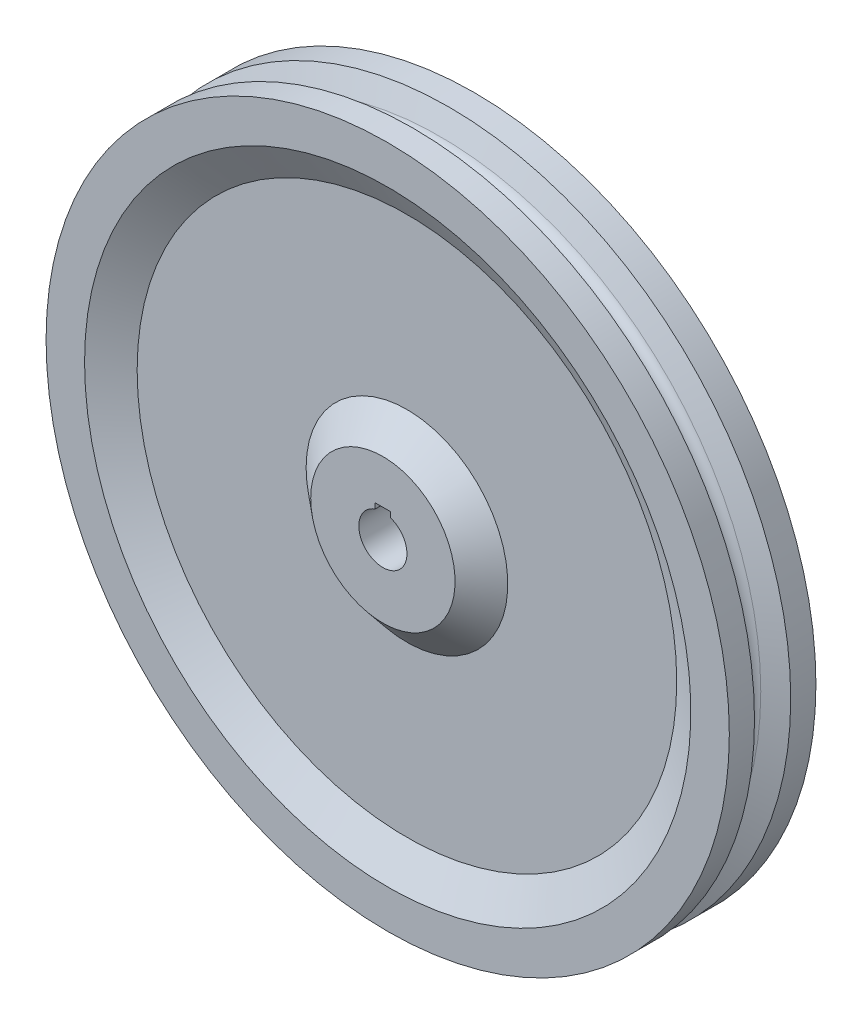
ISO-10303-21;
HEADER;
FILE_DESCRIPTION(('STEP AP214'),'2;1');
FILE_NAME('part.step','',(''),(''),'','','');
FILE_SCHEMA(('AUTOMOTIVE_DESIGN { 1 0 10303 214 1 1 1 1 }'));
ENDSEC;
DATA;
#1=APPLICATION_CONTEXT('core data for automotive mechanical design processes');
#2=APPLICATION_PROTOCOL_DEFINITION('international standard','automotive_design',2000,#1);
#3=PRODUCT_CONTEXT('',#1,'mechanical');
#4=PRODUCT('Part','Part','',(#3));
#5=PRODUCT_RELATED_PRODUCT_CATEGORY('part','',(#4));
#6=PRODUCT_DEFINITION_FORMATION('','',#4);
#7=PRODUCT_DEFINITION_CONTEXT('part definition',#1,'design');
#8=PRODUCT_DEFINITION('design','',#6,#7);
#9=PRODUCT_DEFINITION_SHAPE('','',#8);
#10=(LENGTH_UNIT() NAMED_UNIT(*) SI_UNIT(.MILLI.,.METRE.));
#11=(NAMED_UNIT(*) PLANE_ANGLE_UNIT() SI_UNIT($,.RADIAN.));
#12=(NAMED_UNIT(*) SI_UNIT($,.STERADIAN.) SOLID_ANGLE_UNIT());
#13=UNCERTAINTY_MEASURE_WITH_UNIT(LENGTH_MEASURE(1.E-05),#10,'distance_accuracy_value','');
#14=(GEOMETRIC_REPRESENTATION_CONTEXT(3) GLOBAL_UNCERTAINTY_ASSIGNED_CONTEXT((#13)) GLOBAL_UNIT_ASSIGNED_CONTEXT((#10,
#11,#12)) REPRESENTATION_CONTEXT('',''));
#15=CARTESIAN_POINT('',(0.,0.,0.));
#16=DIRECTION('',(0.,0.,1.));
#17=DIRECTION('',(1.,0.,0.));
#18=AXIS2_PLACEMENT_3D('',#15,#16,#17);
#19=CARTESIAN_POINT('',(0.,0.,0.));
#20=DIRECTION('',(0.,0.,-1.));
#21=DIRECTION('',(-1.,0.,0.));
#22=AXIS2_PLACEMENT_3D('',#19,#20,#21);
#23=TOROIDAL_SURFACE('',#22,337.,10.5);
#24=CARTESIAN_POINT('',(0.,0.,9.70073509136854));
#25=DIRECTION('',(0.,0.,-1.));
#26=DIRECTION('',(-1.,0.,0.));
#27=AXIS2_PLACEMENT_3D('',#24,#25,#26);
#28=CIRCLE('',#27,332.981823960167);
#29=CARTESIAN_POINT('',(-332.981823960167,0.,9.70073509136854));
#30=VERTEX_POINT('',#29);
#31=EDGE_CURVE('E173',#30,#30,#28,.T.);
#32=ORIENTED_EDGE('',*,*,#31,.T.);
#33=EDGE_LOOP('',(#32));
#34=FACE_BOUND('',#33,.T.);
#35=CARTESIAN_POINT('',(0.,0.,-9.70073509136854));
#36=DIRECTION('',(0.,0.,-1.));
#37=DIRECTION('',(-1.,0.,0.));
#38=AXIS2_PLACEMENT_3D('',#35,#36,#37);
#39=CIRCLE('',#38,332.981823960167);
#40=CARTESIAN_POINT('',(-332.981823960167,0.,-9.70073509136854));
#41=VERTEX_POINT('',#40);
#42=EDGE_CURVE('E145',#41,#41,#39,.T.);
#43=ORIENTED_EDGE('',*,*,#42,.F.);
#44=EDGE_LOOP('',(#43));
#45=FACE_BOUND('',#44,.T.);
#46=ADVANCED_FACE('F39',(#34,#45),#23,.F.);
#47=CARTESIAN_POINT('',(0.,0.,9.70073509136854));
#48=DIRECTION('',(0.,0.,1.));
#49=DIRECTION('',(1.,0.,0.));
#50=AXIS2_PLACEMENT_3D('',#47,#48,#49);
#51=CONICAL_SURFACE('',#50,332.981823960167,1.17809724509617);
#52=CARTESIAN_POINT('',(0.,0.,18.8209622257858));
#53=DIRECTION('',(0.,0.,-1.));
#54=DIRECTION('',(-1.,0.,0.));
#55=AXIS2_PLACEMENT_3D('',#52,#53,#54);
#56=CIRCLE('',#55,355.);
#57=CARTESIAN_POINT('',(-355.,0.,18.8209622257858));
#58=VERTEX_POINT('',#57);
#59=EDGE_CURVE('E169',#58,#58,#56,.T.);
#60=ORIENTED_EDGE('',*,*,#59,.T.);
#61=EDGE_LOOP('',(#60));
#62=FACE_BOUND('',#61,.T.);
#63=ORIENTED_EDGE('',*,*,#31,.F.);
#64=EDGE_LOOP('',(#63));
#65=FACE_BOUND('',#64,.T.);
#66=ADVANCED_FACE('F194',(#62,#65),#51,.T.);
#67=CARTESIAN_POINT('',(0.,0.,0.));
#68=DIRECTION('',(0.,0.,-1.));
#69=DIRECTION('',(-1.,0.,0.));
#70=AXIS2_PLACEMENT_3D('',#67,#68,#69);
#71=CYLINDRICAL_SURFACE('',#70,355.);
#72=CARTESIAN_POINT('',(0.,0.,45.));
#73=DIRECTION('',(0.,0.,-1.));
#74=DIRECTION('',(-1.,0.,0.));
#75=AXIS2_PLACEMENT_3D('',#72,#73,#74);
#76=CIRCLE('',#75,355.);
#77=CARTESIAN_POINT('',(-355.,0.,45.));
#78=VERTEX_POINT('',#77);
#79=EDGE_CURVE('E165',#78,#78,#76,.T.);
#80=ORIENTED_EDGE('',*,*,#79,.T.);
#81=EDGE_LOOP('',(#80));
#82=FACE_BOUND('',#81,.T.);
#83=ORIENTED_EDGE('',*,*,#59,.F.);
#84=EDGE_LOOP('',(#83));
#85=FACE_BOUND('',#84,.T.);
#86=ADVANCED_FACE('F199',(#82,#85),#71,.T.);
#87=CARTESIAN_POINT('',(0.,315.,45.));
#88=DIRECTION('',(0.,0.,1.));
#89=DIRECTION('',(1.,0.,0.));
#90=AXIS2_PLACEMENT_3D('',#87,#88,#89);
#91=PLANE('',#90);
#92=CARTESIAN_POINT('',(0.,0.,45.));
#93=DIRECTION('',(0.,0.,-1.));
#94=DIRECTION('',(-1.,0.,0.));
#95=AXIS2_PLACEMENT_3D('',#92,#93,#94);
#96=CIRCLE('',#95,315.);
#97=CARTESIAN_POINT('',(-315.,0.,45.));
#98=VERTEX_POINT('',#97);
#99=EDGE_CURVE('E161',#98,#98,#96,.T.);
#100=ORIENTED_EDGE('',*,*,#99,.T.);
#101=EDGE_LOOP('',(#100));
#102=FACE_BOUND('',#101,.T.);
#103=ORIENTED_EDGE('',*,*,#79,.F.);
#104=EDGE_LOOP('',(#103));
#105=FACE_BOUND('',#104,.T.);
#106=ADVANCED_FACE('F232',(#102,#105),#91,.T.);
#107=CARTESIAN_POINT('',(0.,0.,45.));
#108=DIRECTION('',(0.,0.,1.));
#109=DIRECTION('',(1.,0.,0.));
#110=AXIS2_PLACEMENT_3D('',#107,#108,#109);
#111=CONICAL_SURFACE('',#110,315.,1.0471975511966);
#112=CARTESIAN_POINT('',(0.,0.,25.));
#113=DIRECTION('',(0.,0.,-1.));
#114=DIRECTION('',(-1.,0.,0.));
#115=AXIS2_PLACEMENT_3D('',#112,#113,#114);
#116=CIRCLE('',#115,280.358983848623);
#117=CARTESIAN_POINT('',(-280.358983848623,0.,25.));
#118=VERTEX_POINT('',#117);
#119=EDGE_CURVE('E157',#118,#118,#116,.T.);
#120=ORIENTED_EDGE('',*,*,#119,.T.);
#121=EDGE_LOOP('',(#120));
#122=FACE_BOUND('',#121,.T.);
#123=ORIENTED_EDGE('',*,*,#99,.F.);
#124=EDGE_LOOP('',(#123));
#125=FACE_BOUND('',#124,.T.);
#126=ADVANCED_FACE('F228',(#122,#125),#111,.F.);
#127=CARTESIAN_POINT('',(0.,104.793839814855,25.));
#128=DIRECTION('',(0.,0.,1.));
#129=DIRECTION('',(1.,0.,0.));
#130=AXIS2_PLACEMENT_3D('',#127,#128,#129);
#131=PLANE('',#130);
#132=CARTESIAN_POINT('',(0.,0.,25.));
#133=DIRECTION('',(0.,0.,-1.));
#134=DIRECTION('',(-1.,0.,0.));
#135=AXIS2_PLACEMENT_3D('',#132,#133,#134);
#136=CIRCLE('',#135,104.793839814855);
#137=CARTESIAN_POINT('',(-104.793839814855,0.,25.));
#138=VERTEX_POINT('',#137);
#139=EDGE_CURVE('E153',#138,#138,#136,.T.);
#140=ORIENTED_EDGE('',*,*,#139,.T.);
#141=EDGE_LOOP('',(#140));
#142=FACE_BOUND('',#141,.T.);
#143=ORIENTED_EDGE('',*,*,#119,.F.);
#144=EDGE_LOOP('',(#143));
#145=FACE_BOUND('',#144,.T.);
#146=ADVANCED_FACE('F224',(#142,#145),#131,.T.);
#147=CARTESIAN_POINT('',(0.,0.,25.));
#148=DIRECTION('',(0.,0.,-1.));
#149=DIRECTION('',(-1.,0.,0.));
#150=AXIS2_PLACEMENT_3D('',#147,#148,#149);
#151=CONICAL_SURFACE('',#150,104.793839814855,0.872664625997163);
#152=CARTESIAN_POINT('',(0.,0.,50.));
#153=DIRECTION('',(0.,0.,-1.));
#154=DIRECTION('',(-1.,0.,0.));
#155=AXIS2_PLACEMENT_3D('',#152,#153,#154);
#156=CIRCLE('',#155,75.);
#157=CARTESIAN_POINT('',(-75.,0.,50.));
#158=VERTEX_POINT('',#157);
#159=EDGE_CURVE('E149',#158,#158,#156,.T.);
#160=ORIENTED_EDGE('',*,*,#159,.T.);
#161=EDGE_LOOP('',(#160));
#162=FACE_BOUND('',#161,.T.);
#163=ORIENTED_EDGE('',*,*,#139,.F.);
#164=EDGE_LOOP('',(#163));
#165=FACE_BOUND('',#164,.T.);
#166=ADVANCED_FACE('F217',(#162,#165),#151,.T.);
#167=CARTESIAN_POINT('',(0.,0.,50.));
#168=DIRECTION('',(0.,0.,1.));
#169=DIRECTION('',(1.,0.,0.));
#170=AXIS2_PLACEMENT_3D('',#167,#168,#169);
#171=PLANE('',#170);
#172=DIRECTION('',(0.,-1.,0.));
#173=VECTOR('',#172,1.);
#174=CARTESIAN_POINT('',(-8.,20.7,50.));
#175=LINE('',#174,#173);
#176=CARTESIAN_POINT('',(-8.,29.3,50.));
#177=VERTEX_POINT('',#176);
#178=CARTESIAN_POINT('',(-8.,23.685438564654,50.));
#179=VERTEX_POINT('',#178);
#180=EDGE_CURVE('E106',#177,#179,#175,.T.);
#181=ORIENTED_EDGE('',*,*,#180,.F.);
#182=DIRECTION('',(-1.,0.,0.));
#183=VECTOR('',#182,1.);
#184=CARTESIAN_POINT('',(8.,29.3,50.));
#185=LINE('',#184,#183);
#186=CARTESIAN_POINT('',(8.,29.3,50.));
#187=VERTEX_POINT('',#186);
#188=EDGE_CURVE('E103',#187,#177,#185,.T.);
#189=ORIENTED_EDGE('',*,*,#188,.F.);
#190=DIRECTION('',(0.,1.,0.));
#191=VECTOR('',#190,1.);
#192=CARTESIAN_POINT('',(8.,20.7,50.));
#193=LINE('',#192,#191);
#194=CARTESIAN_POINT('',(7.99999999999999,23.685438564654,50.));
#195=VERTEX_POINT('',#194);
#196=EDGE_CURVE('E81',#195,#187,#193,.T.);
#197=ORIENTED_EDGE('',*,*,#196,.F.);
#198=CARTESIAN_POINT('',(0.,0.,50.));
#199=DIRECTION('',(0.,0.,1.));
#200=DIRECTION('',(1.,0.,0.));
#201=AXIS2_PLACEMENT_3D('',#198,#199,#200);
#202=CIRCLE('',#201,25.);
#203=EDGE_CURVE('E114',#179,#195,#202,.T.);
#204=ORIENTED_EDGE('',*,*,#203,.F.);
#205=EDGE_LOOP('',(#181,#189,#197,#204));
#206=FACE_BOUND('',#205,.T.);
#207=ORIENTED_EDGE('',*,*,#159,.F.);
#208=EDGE_LOOP('',(#207));
#209=FACE_BOUND('',#208,.T.);
#210=ADVANCED_FACE('F182',(#206,#209),#171,.T.);
#211=CARTESIAN_POINT('',(0.,0.,-9.70073509136854));
#212=DIRECTION('',(0.,0.,-1.));
#213=DIRECTION('',(1.,0.,0.));
#214=AXIS2_PLACEMENT_3D('',#211,#212,#213);
#215=CONICAL_SURFACE('',#214,332.981823960167,1.17809724509617);
#216=CARTESIAN_POINT('',(0.,0.,-18.8209622257858));
#217=DIRECTION('',(0.,0.,-1.));
#218=DIRECTION('',(-1.,0.,0.));
#219=AXIS2_PLACEMENT_3D('',#216,#217,#218);
#220=CIRCLE('',#219,355.);
#221=CARTESIAN_POINT('',(-355.,0.,-18.8209622257858));
#222=VERTEX_POINT('',#221);
#223=EDGE_CURVE('E141',#222,#222,#220,.T.);
#224=ORIENTED_EDGE('',*,*,#223,.F.);
#225=EDGE_LOOP('',(#224));
#226=FACE_BOUND('',#225,.T.);
#227=ORIENTED_EDGE('',*,*,#42,.T.);
#228=EDGE_LOOP('',(#227));
#229=FACE_BOUND('',#228,.T.);
#230=ADVANCED_FACE('F205',(#226,#229),#215,.T.);
#231=CARTESIAN_POINT('',(0.,0.,0.));
#232=DIRECTION('',(0.,0.,1.));
#233=DIRECTION('',(-1.,0.,0.));
#234=AXIS2_PLACEMENT_3D('',#231,#232,#233);
#235=CYLINDRICAL_SURFACE('',#234,355.);
#236=CARTESIAN_POINT('',(0.,0.,-45.));
#237=DIRECTION('',(0.,0.,-1.));
#238=DIRECTION('',(-1.,0.,0.));
#239=AXIS2_PLACEMENT_3D('',#236,#237,#238);
#240=CIRCLE('',#239,355.);
#241=CARTESIAN_POINT('',(-355.,0.,-45.));
#242=VERTEX_POINT('',#241);
#243=EDGE_CURVE('E137',#242,#242,#240,.T.);
#244=ORIENTED_EDGE('',*,*,#243,.F.);
#245=EDGE_LOOP('',(#244));
#246=FACE_BOUND('',#245,.T.);
#247=ORIENTED_EDGE('',*,*,#223,.T.);
#248=EDGE_LOOP('',(#247));
#249=FACE_BOUND('',#248,.T.);
#250=ADVANCED_FACE('F207',(#246,#249),#235,.T.);
#251=CARTESIAN_POINT('',(0.,315.,-45.));
#252=DIRECTION('',(0.,0.,-1.));
#253=DIRECTION('',(1.,0.,0.));
#254=AXIS2_PLACEMENT_3D('',#251,#252,#253);
#255=PLANE('',#254);
#256=CARTESIAN_POINT('',(0.,0.,-45.));
#257=DIRECTION('',(0.,0.,-1.));
#258=DIRECTION('',(-1.,0.,0.));
#259=AXIS2_PLACEMENT_3D('',#256,#257,#258);
#260=CIRCLE('',#259,315.);
#261=CARTESIAN_POINT('',(-315.,0.,-45.));
#262=VERTEX_POINT('',#261);
#263=EDGE_CURVE('E133',#262,#262,#260,.T.);
#264=ORIENTED_EDGE('',*,*,#263,.F.);
#265=EDGE_LOOP('',(#264));
#266=FACE_BOUND('',#265,.T.);
#267=ORIENTED_EDGE('',*,*,#243,.T.);
#268=EDGE_LOOP('',(#267));
#269=FACE_BOUND('',#268,.T.);
#270=ADVANCED_FACE('F214',(#266,#269),#255,.T.);
#271=CARTESIAN_POINT('',(0.,0.,-45.));
#272=DIRECTION('',(0.,0.,-1.));
#273=DIRECTION('',(1.,0.,0.));
#274=AXIS2_PLACEMENT_3D('',#271,#272,#273);
#275=CONICAL_SURFACE('',#274,315.,1.0471975511966);
#276=CARTESIAN_POINT('',(0.,0.,-25.));
#277=DIRECTION('',(0.,0.,-1.));
#278=DIRECTION('',(-1.,0.,0.));
#279=AXIS2_PLACEMENT_3D('',#276,#277,#278);
#280=CIRCLE('',#279,280.358983848623);
#281=CARTESIAN_POINT('',(-280.358983848623,0.,-25.));
#282=VERTEX_POINT('',#281);
#283=EDGE_CURVE('E129',#282,#282,#280,.T.);
#284=ORIENTED_EDGE('',*,*,#283,.F.);
#285=EDGE_LOOP('',(#284));
#286=FACE_BOUND('',#285,.T.);
#287=ORIENTED_EDGE('',*,*,#263,.T.);
#288=EDGE_LOOP('',(#287));
#289=FACE_BOUND('',#288,.T.);
#290=ADVANCED_FACE('F318',(#286,#289),#275,.F.);
#291=CARTESIAN_POINT('',(0.,104.793839814855,-25.));
#292=DIRECTION('',(0.,0.,-1.));
#293=DIRECTION('',(1.,0.,0.));
#294=AXIS2_PLACEMENT_3D('',#291,#292,#293);
#295=PLANE('',#294);
#296=CARTESIAN_POINT('',(0.,0.,-25.));
#297=DIRECTION('',(0.,0.,-1.));
#298=DIRECTION('',(-1.,0.,0.));
#299=AXIS2_PLACEMENT_3D('',#296,#297,#298);
#300=CIRCLE('',#299,104.793839814855);
#301=CARTESIAN_POINT('',(-104.793839814855,0.,-25.));
#302=VERTEX_POINT('',#301);
#303=EDGE_CURVE('E125',#302,#302,#300,.T.);
#304=ORIENTED_EDGE('',*,*,#303,.F.);
#305=EDGE_LOOP('',(#304));
#306=FACE_BOUND('',#305,.T.);
#307=ORIENTED_EDGE('',*,*,#283,.T.);
#308=EDGE_LOOP('',(#307));
#309=FACE_BOUND('',#308,.T.);
#310=ADVANCED_FACE('F313',(#306,#309),#295,.T.);
#311=CARTESIAN_POINT('',(0.,0.,-25.));
#312=DIRECTION('',(0.,0.,1.));
#313=DIRECTION('',(-1.,0.,0.));
#314=AXIS2_PLACEMENT_3D('',#311,#312,#313);
#315=CONICAL_SURFACE('',#314,104.793839814855,0.872664625997163);
#316=CARTESIAN_POINT('',(0.,0.,-50.));
#317=DIRECTION('',(0.,0.,-1.));
#318=DIRECTION('',(-1.,0.,0.));
#319=AXIS2_PLACEMENT_3D('',#316,#317,#318);
#320=CIRCLE('',#319,75.);
#321=CARTESIAN_POINT('',(-75.,0.,-50.));
#322=VERTEX_POINT('',#321);
#323=EDGE_CURVE('E118',#322,#322,#320,.T.);
#324=ORIENTED_EDGE('',*,*,#323,.F.);
#325=EDGE_LOOP('',(#324));
#326=FACE_BOUND('',#325,.T.);
#327=ORIENTED_EDGE('',*,*,#303,.T.);
#328=EDGE_LOOP('',(#327));
#329=FACE_BOUND('',#328,.T.);
#330=ADVANCED_FACE('F275',(#326,#329),#315,.T.);
#331=CARTESIAN_POINT('',(0.,0.,-50.));
#332=DIRECTION('',(0.,0.,-1.));
#333=DIRECTION('',(1.,0.,0.));
#334=AXIS2_PLACEMENT_3D('',#331,#332,#333);
#335=PLANE('',#334);
#336=DIRECTION('',(0.,-1.,0.));
#337=VECTOR('',#336,1.);
#338=CARTESIAN_POINT('',(-8.,20.7,-50.));
#339=LINE('',#338,#337);
#340=CARTESIAN_POINT('',(-8.,29.3,-50.));
#341=VERTEX_POINT('',#340);
#342=CARTESIAN_POINT('',(-8.,23.685438564654,-50.));
#343=VERTEX_POINT('',#342);
#344=EDGE_CURVE('E100',#341,#343,#339,.T.);
#345=ORIENTED_EDGE('',*,*,#344,.T.);
#346=CARTESIAN_POINT('',(0.,0.,-50.));
#347=DIRECTION('',(0.,0.,1.));
#348=DIRECTION('',(1.,0.,0.));
#349=AXIS2_PLACEMENT_3D('',#346,#347,#348);
#350=CIRCLE('',#349,25.);
#351=CARTESIAN_POINT('',(7.99999999999999,23.685438564654,-50.));
#352=VERTEX_POINT('',#351);
#353=EDGE_CURVE('E98',#343,#352,#350,.T.);
#354=ORIENTED_EDGE('',*,*,#353,.T.);
#355=DIRECTION('',(0.,1.,0.));
#356=VECTOR('',#355,1.);
#357=CARTESIAN_POINT('',(8.,20.7,-50.));
#358=LINE('',#357,#356);
#359=CARTESIAN_POINT('',(8.,29.3,-50.));
#360=VERTEX_POINT('',#359);
#361=EDGE_CURVE('E54',#352,#360,#358,.T.);
#362=ORIENTED_EDGE('',*,*,#361,.T.);
#363=DIRECTION('',(-1.,0.,0.));
#364=VECTOR('',#363,1.);
#365=CARTESIAN_POINT('',(8.,29.3,-50.));
#366=LINE('',#365,#364);
#367=EDGE_CURVE('E87',#360,#341,#366,.T.);
#368=ORIENTED_EDGE('',*,*,#367,.T.);
#369=EDGE_LOOP('',(#345,#354,#362,#368));
#370=FACE_BOUND('',#369,.T.);
#371=ORIENTED_EDGE('',*,*,#323,.T.);
#372=EDGE_LOOP('',(#371));
#373=FACE_BOUND('',#372,.T.);
#374=ADVANCED_FACE('F95',(#370,#373),#335,.T.);
#375=CARTESIAN_POINT('',(0.,0.,-50.));
#376=DIRECTION('',(0.,0.,1.));
#377=DIRECTION('',(1.,0.,0.));
#378=AXIS2_PLACEMENT_3D('',#375,#376,#377);
#379=CYLINDRICAL_SURFACE('',#378,25.);
#380=ORIENTED_EDGE('',*,*,#353,.F.);
#381=DIRECTION('',(0.,0.,1.));
#382=VECTOR('',#381,1.);
#383=CARTESIAN_POINT('',(-8.,23.685438564654,-50.));
#384=LINE('',#383,#382);
#385=EDGE_CURVE('E11',#343,#179,#384,.T.);
#386=ORIENTED_EDGE('',*,*,#385,.T.);
#387=ORIENTED_EDGE('',*,*,#203,.T.);
#388=DIRECTION('',(0.,0.,1.));
#389=VECTOR('',#388,1.);
#390=CARTESIAN_POINT('',(7.99999999999999,23.685438564654,-50.));
#391=LINE('',#390,#389);
#392=EDGE_CURVE('E47',#195,#352,#391,.F.);
#393=ORIENTED_EDGE('',*,*,#392,.T.);
#394=EDGE_LOOP('',(#380,#386,#387,#393));
#395=FACE_BOUND('',#394,.T.);
#396=ADVANCED_FACE('F178',(#395),#379,.F.);
#397=CARTESIAN_POINT('',(-8.,20.7,-50.));
#398=DIRECTION('',(-1.,0.,0.));
#399=DIRECTION('',(0.,0.,1.));
#400=AXIS2_PLACEMENT_3D('',#397,#398,#399);
#401=PLANE('',#400);
#402=ORIENTED_EDGE('',*,*,#344,.F.);
#403=DIRECTION('',(0.,0.,1.));
#404=VECTOR('',#403,1.);
#405=CARTESIAN_POINT('',(-8.,29.3,-50.));
#406=LINE('',#405,#404);
#407=EDGE_CURVE('E86',#341,#177,#406,.T.);
#408=ORIENTED_EDGE('',*,*,#407,.T.);
#409=ORIENTED_EDGE('',*,*,#180,.T.);
#410=ORIENTED_EDGE('',*,*,#385,.F.);
#411=EDGE_LOOP('',(#402,#408,#409,#410));
#412=FACE_BOUND('',#411,.T.);
#413=ADVANCED_FACE('F184',(#412),#401,.F.);
#414=CARTESIAN_POINT('',(8.,20.7,-50.));
#415=DIRECTION('',(1.,0.,0.));
#416=DIRECTION('',(0.,0.,-1.));
#417=AXIS2_PLACEMENT_3D('',#414,#415,#416);
#418=PLANE('',#417);
#419=ORIENTED_EDGE('',*,*,#196,.T.);
#420=DIRECTION('',(0.,0.,1.));
#421=VECTOR('',#420,1.);
#422=CARTESIAN_POINT('',(8.,29.3,-50.));
#423=LINE('',#422,#421);
#424=EDGE_CURVE('E77',#360,#187,#423,.T.);
#425=ORIENTED_EDGE('',*,*,#424,.F.);
#426=ORIENTED_EDGE('',*,*,#361,.F.);
#427=ORIENTED_EDGE('',*,*,#392,.F.);
#428=EDGE_LOOP('',(#419,#425,#426,#427));
#429=FACE_BOUND('',#428,.T.);
#430=ADVANCED_FACE('F79',(#429),#418,.F.);
#431=CARTESIAN_POINT('',(8.,29.3,-50.));
#432=DIRECTION('',(0.,1.,0.));
#433=DIRECTION('',(-1.,0.,0.));
#434=AXIS2_PLACEMENT_3D('',#431,#432,#433);
#435=PLANE('',#434);
#436=ORIENTED_EDGE('',*,*,#188,.T.);
#437=ORIENTED_EDGE('',*,*,#407,.F.);
#438=ORIENTED_EDGE('',*,*,#367,.F.);
#439=ORIENTED_EDGE('',*,*,#424,.T.);
#440=EDGE_LOOP('',(#436,#437,#438,#439));
#441=FACE_BOUND('',#440,.T.);
#442=ADVANCED_FACE('F90',(#441),#435,.F.);
#443=CLOSED_SHELL('',(#46,#66,#86,#106,#126,#146,#166,#210,#230,#250,#270,#290,#310,#330,#374,
#396,#413,#430,#442));
#444=MANIFOLD_SOLID_BREP('B2',#443);
#445=ADVANCED_BREP_SHAPE_REPRESENTATION('',(#18,#444),#14);
#446=SHAPE_DEFINITION_REPRESENTATION(#9,#445);
ENDSEC;
END-ISO-10303-21;
